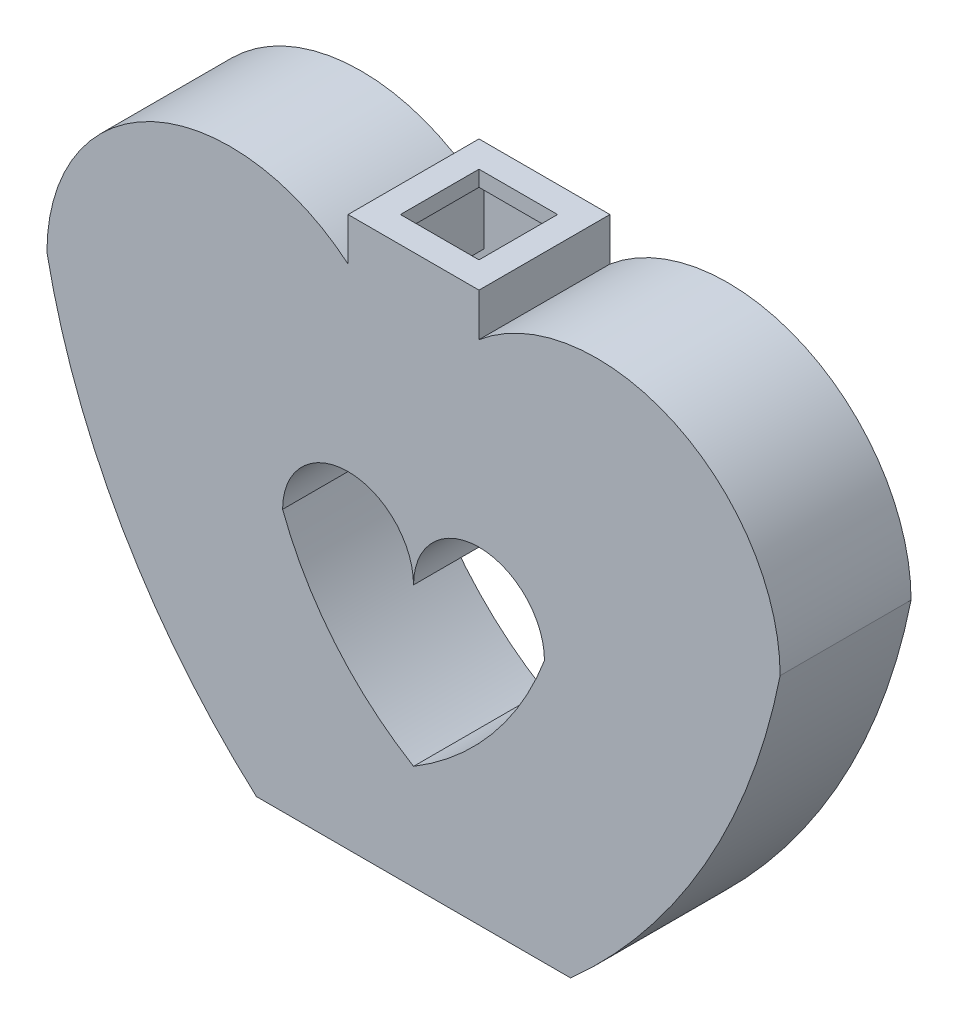
ISO-10303-21;
HEADER;
FILE_DESCRIPTION(('STEP AP214'),'2;1');
FILE_NAME('part.step','',(''),(''),'','','');
FILE_SCHEMA(('AUTOMOTIVE_DESIGN { 1 0 10303 214 1 1 1 1 }'));
ENDSEC;
DATA;
#1=APPLICATION_CONTEXT('core data for automotive mechanical design processes');
#2=APPLICATION_PROTOCOL_DEFINITION('international standard','automotive_design',2000,#1);
#3=PRODUCT_CONTEXT('',#1,'mechanical');
#4=PRODUCT('Part','Part','',(#3));
#5=PRODUCT_RELATED_PRODUCT_CATEGORY('part','',(#4));
#6=PRODUCT_DEFINITION_FORMATION('','',#4);
#7=PRODUCT_DEFINITION_CONTEXT('part definition',#1,'design');
#8=PRODUCT_DEFINITION('design','',#6,#7);
#9=PRODUCT_DEFINITION_SHAPE('','',#8);
#10=(LENGTH_UNIT() NAMED_UNIT(*) SI_UNIT(.MILLI.,.METRE.));
#11=(NAMED_UNIT(*) PLANE_ANGLE_UNIT() SI_UNIT($,.RADIAN.));
#12=(NAMED_UNIT(*) SI_UNIT($,.STERADIAN.) SOLID_ANGLE_UNIT());
#13=UNCERTAINTY_MEASURE_WITH_UNIT(LENGTH_MEASURE(1.E-05),#10,'distance_accuracy_value','');
#14=(GEOMETRIC_REPRESENTATION_CONTEXT(3) GLOBAL_UNCERTAINTY_ASSIGNED_CONTEXT((#13)) GLOBAL_UNIT_ASSIGNED_CONTEXT((#10,
#11,#12)) REPRESENTATION_CONTEXT('',''));
#15=CARTESIAN_POINT('',(0.,0.,0.));
#16=DIRECTION('',(0.,0.,1.));
#17=DIRECTION('',(1.,0.,0.));
#18=AXIS2_PLACEMENT_3D('',#15,#16,#17);
#19=CARTESIAN_POINT('',(0.,3.,25.));
#20=DIRECTION('',(0.,1.,0.));
#21=DIRECTION('',(0.,0.,1.));
#22=AXIS2_PLACEMENT_3D('',#19,#20,#21);
#23=PLANE('',#22);
#24=DIRECTION('',(1.,0.,0.));
#25=VECTOR('',#24,1.);
#26=CARTESIAN_POINT('',(0.,3.,2.));
#27=LINE('',#26,#25);
#28=CARTESIAN_POINT('',(-28.8483161297438,3.,2.));
#29=VERTEX_POINT('',#28);
#30=CARTESIAN_POINT('',(25.8446379227117,3.,2.));
#31=VERTEX_POINT('',#30);
#32=EDGE_CURVE('E375',#29,#31,#27,.T.);
#33=ORIENTED_EDGE('',*,*,#32,.F.);
#34=DIRECTION('',(0.,0.,-1.));
#35=VECTOR('',#34,1.);
#36=CARTESIAN_POINT('',(-28.8483161297438,3.,20.));
#37=LINE('',#36,#35);
#38=CARTESIAN_POINT('',(-28.8483161297438,3.,20.));
#39=VERTEX_POINT('',#38);
#40=EDGE_CURVE('E371',#39,#29,#37,.T.);
#41=ORIENTED_EDGE('',*,*,#40,.F.);
#42=DIRECTION('',(1.,0.,0.));
#43=VECTOR('',#42,1.);
#44=CARTESIAN_POINT('',(0.,3.,20.));
#45=LINE('',#44,#43);
#46=CARTESIAN_POINT('',(25.8446379227117,3.,20.));
#47=VERTEX_POINT('',#46);
#48=EDGE_CURVE('E330',#39,#47,#45,.T.);
#49=ORIENTED_EDGE('',*,*,#48,.T.);
#50=DIRECTION('',(0.,0.,-1.));
#51=VECTOR('',#50,1.);
#52=CARTESIAN_POINT('',(25.8446379227117,3.,20.));
#53=LINE('',#52,#51);
#54=EDGE_CURVE('E364',#47,#31,#53,.T.);
#55=ORIENTED_EDGE('',*,*,#54,.T.);
#56=EDGE_LOOP('',(#33,#41,#49,#55));
#57=FACE_BOUND('',#56,.T.);
#58=ADVANCED_FACE('F47',(#57),#23,.T.);
#59=CARTESIAN_POINT('',(-54.5221019866548,94.7269154209456,25.));
#60=DIRECTION('',(0.,0.,-1.));
#61=DIRECTION('',(-1.,0.,0.));
#62=AXIS2_PLACEMENT_3D('',#59,#60,#61);
#63=CYLINDRICAL_SURFACE('',#62,121.953433310838);
#64=CARTESIAN_POINT('',(-54.5221019866548,94.7269154209456,2.));
#65=DIRECTION('',(0.,0.,1.));
#66=DIRECTION('',(1.,0.,0.));
#67=AXIS2_PLACEMENT_3D('',#64,#65,#66);
#68=CIRCLE('',#67,121.953433310838);
#69=CARTESIAN_POINT('',(66.170757203177,77.2376719586197,2.));
#70=VERTEX_POINT('',#69);
#71=EDGE_CURVE('E368',#31,#70,#68,.T.);
#72=ORIENTED_EDGE('',*,*,#71,.F.);
#73=ORIENTED_EDGE('',*,*,#54,.F.);
#74=CARTESIAN_POINT('',(-54.5221019866548,94.7269154209456,20.));
#75=DIRECTION('',(0.,0.,1.));
#76=DIRECTION('',(1.,0.,0.));
#77=AXIS2_PLACEMENT_3D('',#74,#75,#76);
#78=CIRCLE('',#77,121.953433310838);
#79=CARTESIAN_POINT('',(66.170757203177,77.2376719586197,20.));
#80=VERTEX_POINT('',#79);
#81=EDGE_CURVE('E327',#47,#80,#78,.T.);
#82=ORIENTED_EDGE('',*,*,#81,.T.);
#83=DIRECTION('',(0.,0.,-1.));
#84=VECTOR('',#83,1.);
#85=CARTESIAN_POINT('',(66.170757203177,77.2376719586197,20.));
#86=LINE('',#85,#84);
#87=EDGE_CURVE('E357',#80,#70,#86,.T.);
#88=ORIENTED_EDGE('',*,*,#87,.T.);
#89=EDGE_LOOP('',(#72,#73,#82,#88));
#90=FACE_BOUND('',#89,.T.);
#91=ADVANCED_FACE('F598',(#90),#63,.F.);
#92=CARTESIAN_POINT('',(35.,70.,25.));
#93=DIRECTION('',(0.,0.,-1.));
#94=DIRECTION('',(-1.,0.,0.));
#95=AXIS2_PLACEMENT_3D('',#92,#93,#94);
#96=CYLINDRICAL_SURFACE('',#95,32.);
#97=CARTESIAN_POINT('',(35.,70.,2.));
#98=DIRECTION('',(0.,0.,1.));
#99=DIRECTION('',(1.,0.,0.));
#100=AXIS2_PLACEMENT_3D('',#97,#98,#99);
#101=CIRCLE('',#100,32.);
#102=CARTESIAN_POINT('',(9.50000000000001,89.3326149291816,2.));
#103=VERTEX_POINT('',#102);
#104=EDGE_CURVE('E361',#70,#103,#101,.T.);
#105=ORIENTED_EDGE('',*,*,#104,.F.);
#106=ORIENTED_EDGE('',*,*,#87,.F.);
#107=CARTESIAN_POINT('',(35.,70.,20.));
#108=DIRECTION('',(0.,0.,1.));
#109=DIRECTION('',(1.,0.,0.));
#110=AXIS2_PLACEMENT_3D('',#107,#108,#109);
#111=CIRCLE('',#110,32.);
#112=CARTESIAN_POINT('',(9.50000000000001,89.3326149291816,20.));
#113=VERTEX_POINT('',#112);
#114=EDGE_CURVE('E324',#80,#113,#111,.T.);
#115=ORIENTED_EDGE('',*,*,#114,.T.);
#116=DIRECTION('',(0.,0.,-1.));
#117=VECTOR('',#116,1.);
#118=CARTESIAN_POINT('',(9.50000000000001,89.3326149291816,20.));
#119=LINE('',#118,#117);
#120=EDGE_CURVE('E262',#113,#103,#119,.T.);
#121=ORIENTED_EDGE('',*,*,#120,.T.);
#122=EDGE_LOOP('',(#105,#106,#115,#121));
#123=FACE_BOUND('',#122,.T.);
#124=ADVANCED_FACE('F605',(#123),#96,.F.);
#125=CARTESIAN_POINT('',(-35.,70.,25.));
#126=DIRECTION('',(0.,0.,-1.));
#127=DIRECTION('',(-1.,0.,0.));
#128=AXIS2_PLACEMENT_3D('',#125,#126,#127);
#129=CYLINDRICAL_SURFACE('',#128,32.);
#130=CARTESIAN_POINT('',(-35.,70.,2.));
#131=DIRECTION('',(0.,0.,1.));
#132=DIRECTION('',(1.,0.,0.));
#133=AXIS2_PLACEMENT_3D('',#130,#131,#132);
#134=CIRCLE('',#133,32.);
#135=CARTESIAN_POINT('',(-9.5,89.3326149291816,2.));
#136=VERTEX_POINT('',#135);
#137=CARTESIAN_POINT('',(-66.9986839408012,70.2902172577764,2.));
#138=VERTEX_POINT('',#137);
#139=EDGE_CURVE('E354',#136,#138,#134,.T.);
#140=ORIENTED_EDGE('',*,*,#139,.F.);
#141=DIRECTION('',(0.,0.,-1.));
#142=VECTOR('',#141,1.);
#143=CARTESIAN_POINT('',(-9.5,89.3326149291816,20.));
#144=LINE('',#143,#142);
#145=CARTESIAN_POINT('',(-9.5,89.3326149291816,20.));
#146=VERTEX_POINT('',#145);
#147=EDGE_CURVE('E351',#146,#136,#144,.T.);
#148=ORIENTED_EDGE('',*,*,#147,.F.);
#149=CARTESIAN_POINT('',(-35.,70.,20.));
#150=DIRECTION('',(0.,0.,1.));
#151=DIRECTION('',(1.,0.,0.));
#152=AXIS2_PLACEMENT_3D('',#149,#150,#151);
#153=CIRCLE('',#152,32.);
#154=CARTESIAN_POINT('',(-66.9986839408012,70.2902172577764,20.));
#155=VERTEX_POINT('',#154);
#156=EDGE_CURVE('E336',#146,#155,#153,.T.);
#157=ORIENTED_EDGE('',*,*,#156,.T.);
#158=DIRECTION('',(0.,0.,-1.));
#159=VECTOR('',#158,1.);
#160=CARTESIAN_POINT('',(-66.9986839408012,70.2902172577764,20.));
#161=LINE('',#160,#159);
#162=EDGE_CURVE('E343',#155,#138,#161,.T.);
#163=ORIENTED_EDGE('',*,*,#162,.T.);
#164=EDGE_LOOP('',(#140,#148,#157,#163));
#165=FACE_BOUND('',#164,.T.);
#166=ADVANCED_FACE('F612',(#165),#129,.F.);
#167=CARTESIAN_POINT('',(54.5221019866548,94.7269154209456,25.));
#168=DIRECTION('',(0.,0.,-1.));
#169=DIRECTION('',(-1.,0.,0.));
#170=AXIS2_PLACEMENT_3D('',#167,#168,#169);
#171=CYLINDRICAL_SURFACE('',#170,123.953433310838);
#172=CARTESIAN_POINT('',(54.5221019866548,94.7269154209456,2.));
#173=DIRECTION('',(0.,0.,1.));
#174=DIRECTION('',(1.,0.,0.));
#175=AXIS2_PLACEMENT_3D('',#172,#173,#174);
#176=CIRCLE('',#175,123.953433310838);
#177=EDGE_CURVE('E347',#138,#29,#176,.T.);
#178=ORIENTED_EDGE('',*,*,#177,.F.);
#179=ORIENTED_EDGE('',*,*,#162,.F.);
#180=CARTESIAN_POINT('',(54.5221019866548,94.7269154209456,20.));
#181=DIRECTION('',(0.,0.,1.));
#182=DIRECTION('',(1.,0.,0.));
#183=AXIS2_PLACEMENT_3D('',#180,#181,#182);
#184=CIRCLE('',#183,123.953433310838);
#185=EDGE_CURVE('E333',#155,#39,#184,.T.);
#186=ORIENTED_EDGE('',*,*,#185,.T.);
#187=ORIENTED_EDGE('',*,*,#40,.T.);
#188=EDGE_LOOP('',(#178,#179,#186,#187));
#189=FACE_BOUND('',#188,.T.);
#190=ADVANCED_FACE('F616',(#189),#171,.F.);
#191=CARTESIAN_POINT('',(54.5221019866548,94.7269154209456,20.));
#192=DIRECTION('',(0.,0.,1.));
#193=DIRECTION('',(1.,0.,0.));
#194=AXIS2_PLACEMENT_3D('',#191,#192,#193);
#195=PLANE('',#194);
#196=DIRECTION('',(0.,1.,0.));
#197=VECTOR('',#196,1.);
#198=CARTESIAN_POINT('',(7.5,83.,20.));
#199=LINE('',#198,#197);
#200=CARTESIAN_POINT('',(7.5,102.,20.));
#201=VERTEX_POINT('',#200);
#202=CARTESIAN_POINT('',(7.5,105.,20.));
#203=VERTEX_POINT('',#202);
#204=EDGE_CURVE('E535',#201,#203,#199,.T.);
#205=ORIENTED_EDGE('',*,*,#204,.F.);
#206=DIRECTION('',(1.,0.,0.));
#207=VECTOR('',#206,1.);
#208=CARTESIAN_POINT('',(54.5221019866548,102.,20.));
#209=LINE('',#208,#207);
#210=CARTESIAN_POINT('',(9.50000000000001,102.,20.));
#211=VERTEX_POINT('',#210);
#212=EDGE_CURVE('E248',#201,#211,#209,.T.);
#213=ORIENTED_EDGE('',*,*,#212,.T.);
#214=DIRECTION('',(0.,-1.,0.));
#215=VECTOR('',#214,1.);
#216=CARTESIAN_POINT('',(9.50000000000001,94.7269154209456,20.));
#217=LINE('',#216,#215);
#218=EDGE_CURVE('E270',#211,#113,#217,.T.);
#219=ORIENTED_EDGE('',*,*,#218,.T.);
#220=ORIENTED_EDGE('',*,*,#114,.F.);
#221=ORIENTED_EDGE('',*,*,#81,.F.);
#222=ORIENTED_EDGE('',*,*,#48,.F.);
#223=ORIENTED_EDGE('',*,*,#185,.F.);
#224=ORIENTED_EDGE('',*,*,#156,.F.);
#225=DIRECTION('',(0.,-1.,0.));
#226=VECTOR('',#225,1.);
#227=CARTESIAN_POINT('',(-9.5,105.,20.));
#228=LINE('',#227,#226);
#229=CARTESIAN_POINT('',(-9.5,102.,20.));
#230=VERTEX_POINT('',#229);
#231=EDGE_CURVE('E339',#230,#146,#228,.T.);
#232=ORIENTED_EDGE('',*,*,#231,.F.);
#233=CARTESIAN_POINT('',(-7.5,102.,20.));
#234=VERTEX_POINT('',#233);
#235=EDGE_CURVE('E255',#230,#234,#209,.T.);
#236=ORIENTED_EDGE('',*,*,#235,.T.);
#237=DIRECTION('',(0.,1.,0.));
#238=VECTOR('',#237,1.);
#239=CARTESIAN_POINT('',(-7.5,83.,20.));
#240=LINE('',#239,#238);
#241=CARTESIAN_POINT('',(-7.5,105.,20.));
#242=VERTEX_POINT('',#241);
#243=EDGE_CURVE('E383',#234,#242,#240,.T.);
#244=ORIENTED_EDGE('',*,*,#243,.T.);
#245=DIRECTION('',(-1.,0.,0.));
#246=VECTOR('',#245,1.);
#247=CARTESIAN_POINT('',(0.,105.,20.));
#248=LINE('',#247,#246);
#249=EDGE_CURVE('E527',#203,#242,#248,.T.);
#250=ORIENTED_EDGE('',*,*,#249,.F.);
#251=EDGE_LOOP('',(#205,#213,#219,#220,#221,#222,#223,#224,#232,#236,#244,#250));
#252=FACE_BOUND('',#251,.T.);
#253=CARTESIAN_POINT('',(12.5,50.,20.));
#254=DIRECTION('',(0.,0.,1.));
#255=DIRECTION('',(1.,0.,0.));
#256=AXIS2_PLACEMENT_3D('',#253,#254,#255);
#257=CIRCLE('',#256,15.5);
#258=CARTESIAN_POINT('',(27.9895817233488,49.4317940200073,20.));
#259=VERTEX_POINT('',#258);
#260=CARTESIAN_POINT('',(0.,59.1651513899117,20.));
#261=VERTEX_POINT('',#260);
#262=EDGE_CURVE('E294',#259,#261,#257,.T.);
#263=ORIENTED_EDGE('',*,*,#262,.T.);
#264=CARTESIAN_POINT('',(-12.5,50.,20.));
#265=DIRECTION('',(0.,0.,1.));
#266=DIRECTION('',(1.,0.,0.));
#267=AXIS2_PLACEMENT_3D('',#264,#265,#266);
#268=CIRCLE('',#267,15.5);
#269=CARTESIAN_POINT('',(-27.9895817233488,49.4317940200074,20.));
#270=VERTEX_POINT('',#269);
#271=EDGE_CURVE('E287',#261,#270,#268,.T.);
#272=ORIENTED_EDGE('',*,*,#271,.T.);
#273=CARTESIAN_POINT('',(30.702628548264,71.0021904568865,20.));
#274=DIRECTION('',(0.,0.,1.));
#275=DIRECTION('',(1.,0.,0.));
#276=AXIS2_PLACEMENT_3D('',#273,#274,#275);
#277=CIRCLE('',#276,62.5304529730222);
#278=CARTESIAN_POINT('',(0.,16.5282870788591,20.));
#279=VERTEX_POINT('',#278);
#280=EDGE_CURVE('E281',#270,#279,#277,.T.);
#281=ORIENTED_EDGE('',*,*,#280,.T.);
#282=CARTESIAN_POINT('',(-30.7026285482639,71.0021904568865,20.));
#283=DIRECTION('',(0.,0.,1.));
#284=DIRECTION('',(1.,0.,0.));
#285=AXIS2_PLACEMENT_3D('',#282,#283,#284);
#286=CIRCLE('',#285,62.5304529730221);
#287=EDGE_CURVE('E301',#279,#259,#286,.T.);
#288=ORIENTED_EDGE('',*,*,#287,.T.);
#289=EDGE_LOOP('',(#263,#272,#281,#288));
#290=FACE_BOUND('',#289,.T.);
#291=ADVANCED_FACE('F386',(#252,#290),#195,.F.);
#292=CARTESIAN_POINT('',(54.5221019866548,94.7269154209456,2.));
#293=DIRECTION('',(0.,0.,1.));
#294=DIRECTION('',(1.,0.,0.));
#295=AXIS2_PLACEMENT_3D('',#292,#293,#294);
#296=PLANE('',#295);
#297=ORIENTED_EDGE('',*,*,#139,.T.);
#298=ORIENTED_EDGE('',*,*,#177,.T.);
#299=ORIENTED_EDGE('',*,*,#32,.T.);
#300=ORIENTED_EDGE('',*,*,#71,.T.);
#301=ORIENTED_EDGE('',*,*,#104,.T.);
#302=DIRECTION('',(0.,-1.,0.));
#303=VECTOR('',#302,1.);
#304=CARTESIAN_POINT('',(9.50000000000001,94.7269154209456,2.));
#305=LINE('',#304,#303);
#306=CARTESIAN_POINT('',(9.50000000000001,102.,2.));
#307=VERTEX_POINT('',#306);
#308=EDGE_CURVE('E320',#307,#103,#305,.T.);
#309=ORIENTED_EDGE('',*,*,#308,.F.);
#310=DIRECTION('',(-1.,0.,0.));
#311=VECTOR('',#310,1.);
#312=CARTESIAN_POINT('',(0.,102.,2.));
#313=LINE('',#312,#311);
#314=CARTESIAN_POINT('',(-9.5,102.,2.));
#315=VERTEX_POINT('',#314);
#316=EDGE_CURVE('E235',#307,#315,#313,.T.);
#317=ORIENTED_EDGE('',*,*,#316,.T.);
#318=DIRECTION('',(0.,-1.,0.));
#319=VECTOR('',#318,1.);
#320=CARTESIAN_POINT('',(-9.5,105.,2.));
#321=LINE('',#320,#319);
#322=EDGE_CURVE('E273',#315,#136,#321,.T.);
#323=ORIENTED_EDGE('',*,*,#322,.T.);
#324=EDGE_LOOP('',(#297,#298,#299,#300,#301,#309,#317,#323));
#325=FACE_BOUND('',#324,.T.);
#326=CARTESIAN_POINT('',(-30.7026285482639,71.0021904568865,2.));
#327=DIRECTION('',(0.,0.,1.));
#328=DIRECTION('',(1.,0.,0.));
#329=AXIS2_PLACEMENT_3D('',#326,#327,#328);
#330=CIRCLE('',#329,62.5304529730221);
#331=CARTESIAN_POINT('',(0.,16.5282870788591,2.));
#332=VERTEX_POINT('',#331);
#333=CARTESIAN_POINT('',(27.9895817233488,49.4317940200073,2.));
#334=VERTEX_POINT('',#333);
#335=EDGE_CURVE('E316',#332,#334,#330,.T.);
#336=ORIENTED_EDGE('',*,*,#335,.F.);
#337=CARTESIAN_POINT('',(30.702628548264,71.0021904568865,2.));
#338=DIRECTION('',(0.,0.,1.));
#339=DIRECTION('',(1.,0.,0.));
#340=AXIS2_PLACEMENT_3D('',#337,#338,#339);
#341=CIRCLE('',#340,62.5304529730222);
#342=CARTESIAN_POINT('',(-27.9895817233488,49.4317940200074,2.));
#343=VERTEX_POINT('',#342);
#344=EDGE_CURVE('E304',#343,#332,#341,.T.);
#345=ORIENTED_EDGE('',*,*,#344,.F.);
#346=CARTESIAN_POINT('',(-12.5,50.,2.));
#347=DIRECTION('',(0.,0.,1.));
#348=DIRECTION('',(1.,0.,0.));
#349=AXIS2_PLACEMENT_3D('',#346,#347,#348);
#350=CIRCLE('',#349,15.5);
#351=CARTESIAN_POINT('',(0.,59.1651513899117,2.));
#352=VERTEX_POINT('',#351);
#353=EDGE_CURVE('E308',#352,#343,#350,.T.);
#354=ORIENTED_EDGE('',*,*,#353,.F.);
#355=CARTESIAN_POINT('',(12.5,50.,2.));
#356=DIRECTION('',(0.,0.,1.));
#357=DIRECTION('',(1.,0.,0.));
#358=AXIS2_PLACEMENT_3D('',#355,#356,#357);
#359=CIRCLE('',#358,15.5);
#360=EDGE_CURVE('E312',#334,#352,#359,.T.);
#361=ORIENTED_EDGE('',*,*,#360,.F.);
#362=EDGE_LOOP('',(#336,#345,#354,#361));
#363=FACE_BOUND('',#362,.T.);
#364=ADVANCED_FACE('F623',(#325,#363),#296,.T.);
#365=CARTESIAN_POINT('',(-30.7026285482639,71.0021904568865,25.));
#366=DIRECTION('',(0.,0.,-1.));
#367=DIRECTION('',(-1.,0.,0.));
#368=AXIS2_PLACEMENT_3D('',#365,#366,#367);
#369=CYLINDRICAL_SURFACE('',#368,62.5304529730221);
#370=ORIENTED_EDGE('',*,*,#335,.T.);
#371=DIRECTION('',(0.,0.,-1.));
#372=VECTOR('',#371,1.);
#373=CARTESIAN_POINT('',(27.9895817233488,49.4317940200073,20.));
#374=LINE('',#373,#372);
#375=EDGE_CURVE('E297',#259,#334,#374,.T.);
#376=ORIENTED_EDGE('',*,*,#375,.F.);
#377=ORIENTED_EDGE('',*,*,#287,.F.);
#378=DIRECTION('',(0.,0.,-1.));
#379=VECTOR('',#378,1.);
#380=CARTESIAN_POINT('',(0.,16.5282870788591,20.));
#381=LINE('',#380,#379);
#382=EDGE_CURVE('E277',#279,#332,#381,.T.);
#383=ORIENTED_EDGE('',*,*,#382,.T.);
#384=EDGE_LOOP('',(#370,#376,#377,#383));
#385=FACE_BOUND('',#384,.T.);
#386=ADVANCED_FACE('F626',(#385),#369,.T.);
#387=CARTESIAN_POINT('',(12.5,50.,25.));
#388=DIRECTION('',(0.,0.,-1.));
#389=DIRECTION('',(-1.,0.,0.));
#390=AXIS2_PLACEMENT_3D('',#387,#388,#389);
#391=CYLINDRICAL_SURFACE('',#390,15.5);
#392=ORIENTED_EDGE('',*,*,#360,.T.);
#393=DIRECTION('',(0.,0.,-1.));
#394=VECTOR('',#393,1.);
#395=CARTESIAN_POINT('',(0.,59.1651513899117,12.5));
#396=LINE('',#395,#394);
#397=EDGE_CURVE('E291',#261,#352,#396,.T.);
#398=ORIENTED_EDGE('',*,*,#397,.F.);
#399=ORIENTED_EDGE('',*,*,#262,.F.);
#400=ORIENTED_EDGE('',*,*,#375,.T.);
#401=EDGE_LOOP('',(#392,#398,#399,#400));
#402=FACE_BOUND('',#401,.T.);
#403=ADVANCED_FACE('F629',(#402),#391,.T.);
#404=CARTESIAN_POINT('',(-12.5,50.,25.));
#405=DIRECTION('',(0.,0.,-1.));
#406=DIRECTION('',(-1.,0.,0.));
#407=AXIS2_PLACEMENT_3D('',#404,#405,#406);
#408=CYLINDRICAL_SURFACE('',#407,15.5);
#409=ORIENTED_EDGE('',*,*,#353,.T.);
#410=DIRECTION('',(0.,0.,-1.));
#411=VECTOR('',#410,1.);
#412=CARTESIAN_POINT('',(-27.9895817233488,49.4317940200074,20.));
#413=LINE('',#412,#411);
#414=EDGE_CURVE('E284',#270,#343,#413,.T.);
#415=ORIENTED_EDGE('',*,*,#414,.F.);
#416=ORIENTED_EDGE('',*,*,#271,.F.);
#417=ORIENTED_EDGE('',*,*,#397,.T.);
#418=EDGE_LOOP('',(#409,#415,#416,#417));
#419=FACE_BOUND('',#418,.T.);
#420=ADVANCED_FACE('F633',(#419),#408,.T.);
#421=CARTESIAN_POINT('',(30.702628548264,71.0021904568865,25.));
#422=DIRECTION('',(0.,0.,-1.));
#423=DIRECTION('',(-1.,0.,0.));
#424=AXIS2_PLACEMENT_3D('',#421,#422,#423);
#425=CYLINDRICAL_SURFACE('',#424,62.5304529730222);
#426=ORIENTED_EDGE('',*,*,#344,.T.);
#427=ORIENTED_EDGE('',*,*,#382,.F.);
#428=ORIENTED_EDGE('',*,*,#280,.F.);
#429=ORIENTED_EDGE('',*,*,#414,.T.);
#430=EDGE_LOOP('',(#426,#427,#428,#429));
#431=FACE_BOUND('',#430,.T.);
#432=ADVANCED_FACE('F637',(#431),#425,.T.);
#433=CARTESIAN_POINT('',(-9.5,105.,25.));
#434=DIRECTION('',(1.,0.,0.));
#435=DIRECTION('',(0.,0.,-1.));
#436=AXIS2_PLACEMENT_3D('',#433,#434,#435);
#437=PLANE('',#436);
#438=ORIENTED_EDGE('',*,*,#322,.F.);
#439=DIRECTION('',(0.,0.,1.));
#440=VECTOR('',#439,1.);
#441=CARTESIAN_POINT('',(-9.5,102.,0.));
#442=LINE('',#441,#440);
#443=EDGE_CURVE('E256',#315,#230,#442,.T.);
#444=ORIENTED_EDGE('',*,*,#443,.T.);
#445=ORIENTED_EDGE('',*,*,#231,.T.);
#446=ORIENTED_EDGE('',*,*,#147,.T.);
#447=EDGE_LOOP('',(#438,#444,#445,#446));
#448=FACE_BOUND('',#447,.T.);
#449=ADVANCED_FACE('F393',(#448),#437,.T.);
#450=CARTESIAN_POINT('',(9.50000000000001,105.,0.));
#451=DIRECTION('',(-1.,0.,0.));
#452=DIRECTION('',(0.,0.,1.));
#453=AXIS2_PLACEMENT_3D('',#450,#451,#452);
#454=PLANE('',#453);
#455=ORIENTED_EDGE('',*,*,#218,.F.);
#456=DIRECTION('',(0.,0.,-1.));
#457=VECTOR('',#456,1.);
#458=CARTESIAN_POINT('',(9.50000000000001,102.,0.));
#459=LINE('',#458,#457);
#460=EDGE_CURVE('E250',#211,#307,#459,.T.);
#461=ORIENTED_EDGE('',*,*,#460,.T.);
#462=ORIENTED_EDGE('',*,*,#308,.T.);
#463=ORIENTED_EDGE('',*,*,#120,.F.);
#464=EDGE_LOOP('',(#455,#461,#462,#463));
#465=FACE_BOUND('',#464,.T.);
#466=ADVANCED_FACE('F643',(#465),#454,.T.);
#467=CARTESIAN_POINT('',(0.,102.,0.));
#468=DIRECTION('',(0.,-1.,0.));
#469=DIRECTION('',(0.,0.,-1.));
#470=AXIS2_PLACEMENT_3D('',#467,#468,#469);
#471=PLANE('',#470);
#472=DIRECTION('',(0.,0.,1.));
#473=VECTOR('',#472,1.);
#474=CARTESIAN_POINT('',(7.5,102.,0.));
#475=LINE('',#474,#473);
#476=CARTESIAN_POINT('',(7.5,102.,5.));
#477=VERTEX_POINT('',#476);
#478=EDGE_CURVE('E11',#477,#201,#475,.T.);
#479=ORIENTED_EDGE('',*,*,#478,.F.);
#480=DIRECTION('',(1.,0.,0.));
#481=VECTOR('',#480,1.);
#482=CARTESIAN_POINT('',(0.,102.,5.));
#483=LINE('',#482,#481);
#484=CARTESIAN_POINT('',(-7.5,102.,5.));
#485=VERTEX_POINT('',#484);
#486=EDGE_CURVE('E229',#485,#477,#483,.T.);
#487=ORIENTED_EDGE('',*,*,#486,.F.);
#488=DIRECTION('',(0.,0.,-1.));
#489=VECTOR('',#488,1.);
#490=CARTESIAN_POINT('',(-7.5,102.,0.));
#491=LINE('',#490,#489);
#492=EDGE_CURVE('E56',#234,#485,#491,.T.);
#493=ORIENTED_EDGE('',*,*,#492,.F.);
#494=ORIENTED_EDGE('',*,*,#235,.F.);
#495=ORIENTED_EDGE('',*,*,#443,.F.);
#496=ORIENTED_EDGE('',*,*,#316,.F.);
#497=ORIENTED_EDGE('',*,*,#460,.F.);
#498=ORIENTED_EDGE('',*,*,#212,.F.);
#499=EDGE_LOOP('',(#479,#487,#493,#494,#495,#496,#497,#498));
#500=FACE_BOUND('',#499,.T.);
#501=ADVANCED_FACE('F49',(#500),#471,.T.);
#502=CARTESIAN_POINT('',(7.5,83.,20.));
#503=DIRECTION('',(1.,0.,0.));
#504=DIRECTION('',(0.,0.,-1.));
#505=AXIS2_PLACEMENT_3D('',#502,#503,#504);
#506=PLANE('',#505);
#507=DIRECTION('',(0.,1.,0.));
#508=VECTOR('',#507,1.);
#509=CARTESIAN_POINT('',(7.5,83.,5.));
#510=LINE('',#509,#508);
#511=CARTESIAN_POINT('',(7.5,105.,5.));
#512=VERTEX_POINT('',#511);
#513=EDGE_CURVE('E63',#477,#512,#510,.T.);
#514=ORIENTED_EDGE('',*,*,#513,.F.);
#515=ORIENTED_EDGE('',*,*,#478,.T.);
#516=ORIENTED_EDGE('',*,*,#204,.T.);
#517=DIRECTION('',(0.,0.,1.));
#518=VECTOR('',#517,1.);
#519=CARTESIAN_POINT('',(7.5,105.,0.));
#520=LINE('',#519,#518);
#521=EDGE_CURVE('E242',#512,#203,#520,.T.);
#522=ORIENTED_EDGE('',*,*,#521,.F.);
#523=EDGE_LOOP('',(#514,#515,#516,#522));
#524=FACE_BOUND('',#523,.T.);
#525=ADVANCED_FACE('F238',(#524),#506,.F.);
#526=CARTESIAN_POINT('',(-7.5,83.,20.));
#527=DIRECTION('',(-1.,0.,0.));
#528=DIRECTION('',(0.,0.,1.));
#529=AXIS2_PLACEMENT_3D('',#526,#527,#528);
#530=PLANE('',#529);
#531=ORIENTED_EDGE('',*,*,#243,.F.);
#532=ORIENTED_EDGE('',*,*,#492,.T.);
#533=DIRECTION('',(0.,1.,0.));
#534=VECTOR('',#533,1.);
#535=CARTESIAN_POINT('',(-7.5,83.,5.));
#536=LINE('',#535,#534);
#537=CARTESIAN_POINT('',(-7.5,105.,5.));
#538=VERTEX_POINT('',#537);
#539=EDGE_CURVE('E68',#485,#538,#536,.T.);
#540=ORIENTED_EDGE('',*,*,#539,.T.);
#541=DIRECTION('',(0.,0.,-1.));
#542=VECTOR('',#541,1.);
#543=CARTESIAN_POINT('',(-7.5,105.,0.));
#544=LINE('',#543,#542);
#545=EDGE_CURVE('E530',#242,#538,#544,.T.);
#546=ORIENTED_EDGE('',*,*,#545,.F.);
#547=EDGE_LOOP('',(#531,#532,#540,#546));
#548=FACE_BOUND('',#547,.T.);
#549=ADVANCED_FACE('F380',(#548),#530,.F.);
#550=CARTESIAN_POINT('',(-7.5,83.,5.));
#551=DIRECTION('',(0.,0.,-1.));
#552=DIRECTION('',(-1.,0.,0.));
#553=AXIS2_PLACEMENT_3D('',#550,#551,#552);
#554=PLANE('',#553);
#555=ORIENTED_EDGE('',*,*,#539,.F.);
#556=ORIENTED_EDGE('',*,*,#486,.T.);
#557=ORIENTED_EDGE('',*,*,#513,.T.);
#558=DIRECTION('',(1.,0.,0.));
#559=VECTOR('',#558,1.);
#560=CARTESIAN_POINT('',(0.,105.,5.));
#561=LINE('',#560,#559);
#562=EDGE_CURVE('E533',#538,#512,#561,.T.);
#563=ORIENTED_EDGE('',*,*,#562,.F.);
#564=EDGE_LOOP('',(#555,#556,#557,#563));
#565=FACE_BOUND('',#564,.T.);
#566=ADVANCED_FACE('F230',(#565),#554,.F.);
#567=CARTESIAN_POINT('',(0.,0.,25.));
#568=DIRECTION('',(0.,1.,0.));
#569=DIRECTION('',(0.,0.,1.));
#570=AXIS2_PLACEMENT_3D('',#567,#568,#569);
#571=PLANE('',#570);
#572=DIRECTION('',(1.,0.,0.));
#573=VECTOR('',#572,1.);
#574=CARTESIAN_POINT('',(0.,0.,0.));
#575=LINE('',#574,#573);
#576=CARTESIAN_POINT('',(-30.,0.,0.));
#577=VERTEX_POINT('',#576);
#578=CARTESIAN_POINT('',(30.,0.,0.));
#579=VERTEX_POINT('',#578);
#580=EDGE_CURVE('E437',#577,#579,#575,.T.);
#581=ORIENTED_EDGE('',*,*,#580,.T.);
#582=DIRECTION('',(0.,0.,-1.));
#583=VECTOR('',#582,1.);
#584=CARTESIAN_POINT('',(30.,0.,25.));
#585=LINE('',#584,#583);
#586=CARTESIAN_POINT('',(30.,0.,25.));
#587=VERTEX_POINT('',#586);
#588=EDGE_CURVE('E377',#587,#579,#585,.T.);
#589=ORIENTED_EDGE('',*,*,#588,.F.);
#590=DIRECTION('',(1.,0.,0.));
#591=VECTOR('',#590,1.);
#592=CARTESIAN_POINT('',(0.,0.,25.));
#593=LINE('',#592,#591);
#594=CARTESIAN_POINT('',(-30.,0.,25.));
#595=VERTEX_POINT('',#594);
#596=EDGE_CURVE('E427',#595,#587,#593,.T.);
#597=ORIENTED_EDGE('',*,*,#596,.F.);
#598=DIRECTION('',(0.,0.,-1.));
#599=VECTOR('',#598,1.);
#600=CARTESIAN_POINT('',(-30.,0.,25.));
#601=LINE('',#600,#599);
#602=EDGE_CURVE('E418',#595,#577,#601,.T.);
#603=ORIENTED_EDGE('',*,*,#602,.T.);
#604=EDGE_LOOP('',(#581,#589,#597,#603));
#605=FACE_BOUND('',#604,.T.);
#606=ADVANCED_FACE('F582',(#605),#571,.F.);
#607=CARTESIAN_POINT('',(-54.5221019866548,94.7269154209456,25.));
#608=DIRECTION('',(0.,0.,-1.));
#609=DIRECTION('',(-1.,0.,0.));
#610=AXIS2_PLACEMENT_3D('',#607,#608,#609);
#611=CYLINDRICAL_SURFACE('',#610,126.953433310838);
#612=CARTESIAN_POINT('',(-54.5221019866548,94.7269154209456,0.));
#613=DIRECTION('',(0.,0.,1.));
#614=DIRECTION('',(1.,0.,0.));
#615=AXIS2_PLACEMENT_3D('',#612,#613,#614);
#616=CIRCLE('',#615,126.953433310838);
#617=CARTESIAN_POINT('',(70.,69.9999999999999,0.));
#618=VERTEX_POINT('',#617);
#619=EDGE_CURVE('E434',#579,#618,#616,.T.);
#620=ORIENTED_EDGE('',*,*,#619,.T.);
#621=DIRECTION('',(0.,0.,-1.));
#622=VECTOR('',#621,1.);
#623=CARTESIAN_POINT('',(70.,69.9999999999999,25.));
#624=LINE('',#623,#622);
#625=CARTESIAN_POINT('',(70.,69.9999999999999,25.));
#626=VERTEX_POINT('',#625);
#627=EDGE_CURVE('E403',#626,#618,#624,.T.);
#628=ORIENTED_EDGE('',*,*,#627,.F.);
#629=CARTESIAN_POINT('',(-54.5221019866548,94.7269154209456,25.));
#630=DIRECTION('',(0.,0.,1.));
#631=DIRECTION('',(1.,0.,0.));
#632=AXIS2_PLACEMENT_3D('',#629,#630,#631);
#633=CIRCLE('',#632,126.953433310838);
#634=EDGE_CURVE('E449',#587,#626,#633,.T.);
#635=ORIENTED_EDGE('',*,*,#634,.F.);
#636=ORIENTED_EDGE('',*,*,#588,.T.);
#637=EDGE_LOOP('',(#620,#628,#635,#636));
#638=FACE_BOUND('',#637,.T.);
#639=ADVANCED_FACE('F585',(#638),#611,.T.);
#640=CARTESIAN_POINT('',(35.,70.,25.));
#641=DIRECTION('',(0.,0.,-1.));
#642=DIRECTION('',(-1.,0.,0.));
#643=AXIS2_PLACEMENT_3D('',#640,#641,#642);
#644=CYLINDRICAL_SURFACE('',#643,35.);
#645=CARTESIAN_POINT('',(35.,70.,0.));
#646=DIRECTION('',(0.,0.,1.));
#647=DIRECTION('',(1.,0.,0.));
#648=AXIS2_PLACEMENT_3D('',#645,#646,#647);
#649=CIRCLE('',#648,35.);
#650=CARTESIAN_POINT('',(12.5,96.809513236909,0.));
#651=VERTEX_POINT('',#650);
#652=EDGE_CURVE('E431',#618,#651,#649,.T.);
#653=ORIENTED_EDGE('',*,*,#652,.T.);
#654=DIRECTION('',(0.,0.,-1.));
#655=VECTOR('',#654,1.);
#656=CARTESIAN_POINT('',(12.5,96.809513236909,25.));
#657=LINE('',#656,#655);
#658=CARTESIAN_POINT('',(12.5,96.809513236909,25.));
#659=VERTEX_POINT('',#658);
#660=EDGE_CURVE('E407',#659,#651,#657,.T.);
#661=ORIENTED_EDGE('',*,*,#660,.F.);
#662=CARTESIAN_POINT('',(35.,70.,25.));
#663=DIRECTION('',(0.,0.,1.));
#664=DIRECTION('',(1.,0.,0.));
#665=AXIS2_PLACEMENT_3D('',#662,#663,#664);
#666=CIRCLE('',#665,35.);
#667=EDGE_CURVE('E446',#626,#659,#666,.T.);
#668=ORIENTED_EDGE('',*,*,#667,.F.);
#669=ORIENTED_EDGE('',*,*,#627,.T.);
#670=EDGE_LOOP('',(#653,#661,#668,#669));
#671=FACE_BOUND('',#670,.T.);
#672=ADVANCED_FACE('F587',(#671),#644,.T.);
#673=CARTESIAN_POINT('',(-35.,70.,25.));
#674=DIRECTION('',(0.,0.,-1.));
#675=DIRECTION('',(-1.,0.,0.));
#676=AXIS2_PLACEMENT_3D('',#673,#674,#675);
#677=CYLINDRICAL_SURFACE('',#676,35.);
#678=CARTESIAN_POINT('',(-35.,70.,0.));
#679=DIRECTION('',(0.,0.,1.));
#680=DIRECTION('',(1.,0.,0.));
#681=AXIS2_PLACEMENT_3D('',#678,#679,#680);
#682=CIRCLE('',#681,35.);
#683=CARTESIAN_POINT('',(-12.5,96.809513236909,0.));
#684=VERTEX_POINT('',#683);
#685=CARTESIAN_POINT('',(-70.,70.,0.));
#686=VERTEX_POINT('',#685);
#687=EDGE_CURVE('E428',#684,#686,#682,.T.);
#688=ORIENTED_EDGE('',*,*,#687,.T.);
#689=DIRECTION('',(0.,0.,-1.));
#690=VECTOR('',#689,1.);
#691=CARTESIAN_POINT('',(-70.,70.,25.));
#692=LINE('',#691,#690);
#693=CARTESIAN_POINT('',(-70.,70.,25.));
#694=VERTEX_POINT('',#693);
#695=EDGE_CURVE('E414',#694,#686,#692,.T.);
#696=ORIENTED_EDGE('',*,*,#695,.F.);
#697=CARTESIAN_POINT('',(-35.,70.,25.));
#698=DIRECTION('',(0.,0.,1.));
#699=DIRECTION('',(1.,0.,0.));
#700=AXIS2_PLACEMENT_3D('',#697,#698,#699);
#701=CIRCLE('',#700,35.);
#702=CARTESIAN_POINT('',(-12.5,96.809513236909,25.));
#703=VERTEX_POINT('',#702);
#704=EDGE_CURVE('E443',#703,#694,#701,.T.);
#705=ORIENTED_EDGE('',*,*,#704,.F.);
#706=DIRECTION('',(0.,0.,-1.));
#707=VECTOR('',#706,1.);
#708=CARTESIAN_POINT('',(-12.5,96.809513236909,25.));
#709=LINE('',#708,#707);
#710=EDGE_CURVE('E411',#703,#684,#709,.T.);
#711=ORIENTED_EDGE('',*,*,#710,.T.);
#712=EDGE_LOOP('',(#688,#696,#705,#711));
#713=FACE_BOUND('',#712,.T.);
#714=ADVANCED_FACE('F572',(#713),#677,.T.);
#715=CARTESIAN_POINT('',(54.5221019866548,94.7269154209456,25.));
#716=DIRECTION('',(0.,0.,-1.));
#717=DIRECTION('',(-1.,0.,0.));
#718=AXIS2_PLACEMENT_3D('',#715,#716,#717);
#719=CYLINDRICAL_SURFACE('',#718,126.953433310838);
#720=CARTESIAN_POINT('',(54.5221019866548,94.7269154209456,0.));
#721=DIRECTION('',(0.,0.,1.));
#722=DIRECTION('',(1.,0.,0.));
#723=AXIS2_PLACEMENT_3D('',#720,#721,#722);
#724=CIRCLE('',#723,126.953433310838);
#725=EDGE_CURVE('E423',#686,#577,#724,.T.);
#726=ORIENTED_EDGE('',*,*,#725,.T.);
#727=ORIENTED_EDGE('',*,*,#602,.F.);
#728=CARTESIAN_POINT('',(54.5221019866548,94.7269154209456,25.));
#729=DIRECTION('',(0.,0.,1.));
#730=DIRECTION('',(1.,0.,0.));
#731=AXIS2_PLACEMENT_3D('',#728,#729,#730);
#732=CIRCLE('',#731,126.953433310838);
#733=EDGE_CURVE('E422',#694,#595,#732,.T.);
#734=ORIENTED_EDGE('',*,*,#733,.F.);
#735=ORIENTED_EDGE('',*,*,#695,.T.);
#736=EDGE_LOOP('',(#726,#727,#734,#735));
#737=FACE_BOUND('',#736,.T.);
#738=ADVANCED_FACE('F575',(#737),#719,.T.);
#739=CARTESIAN_POINT('',(54.5221019866548,94.7269154209456,25.));
#740=DIRECTION('',(0.,0.,1.));
#741=DIRECTION('',(1.,0.,0.));
#742=AXIS2_PLACEMENT_3D('',#739,#740,#741);
#743=PLANE('',#742);
#744=DIRECTION('',(0.,-1.,0.));
#745=VECTOR('',#744,1.);
#746=CARTESIAN_POINT('',(-12.5,105.,25.));
#747=LINE('',#746,#745);
#748=CARTESIAN_POINT('',(-12.5,105.,25.));
#749=VERTEX_POINT('',#748);
#750=EDGE_CURVE('E485',#749,#703,#747,.T.);
#751=ORIENTED_EDGE('',*,*,#750,.T.);
#752=ORIENTED_EDGE('',*,*,#704,.T.);
#753=ORIENTED_EDGE('',*,*,#733,.T.);
#754=ORIENTED_EDGE('',*,*,#596,.T.);
#755=ORIENTED_EDGE('',*,*,#634,.T.);
#756=ORIENTED_EDGE('',*,*,#667,.T.);
#757=DIRECTION('',(0.,-1.,0.));
#758=VECTOR('',#757,1.);
#759=CARTESIAN_POINT('',(12.5,105.,25.));
#760=LINE('',#759,#758);
#761=CARTESIAN_POINT('',(12.5,105.,25.));
#762=VERTEX_POINT('',#761);
#763=EDGE_CURVE('E500',#762,#659,#760,.T.);
#764=ORIENTED_EDGE('',*,*,#763,.F.);
#765=DIRECTION('',(1.,0.,0.));
#766=VECTOR('',#765,1.);
#767=CARTESIAN_POINT('',(12.5,105.,25.));
#768=LINE('',#767,#766);
#769=EDGE_CURVE('E518',#749,#762,#768,.T.);
#770=ORIENTED_EDGE('',*,*,#769,.F.);
#771=EDGE_LOOP('',(#751,#752,#753,#754,#755,#756,#764,#770));
#772=FACE_BOUND('',#771,.T.);
#773=CARTESIAN_POINT('',(12.5,50.,25.));
#774=DIRECTION('',(0.,0.,1.));
#775=DIRECTION('',(1.,0.,0.));
#776=AXIS2_PLACEMENT_3D('',#773,#774,#775);
#777=CIRCLE('',#776,12.5);
#778=CARTESIAN_POINT('',(25.,50.,25.));
#779=VERTEX_POINT('',#778);
#780=CARTESIAN_POINT('',(0.,50.,25.));
#781=VERTEX_POINT('',#780);
#782=EDGE_CURVE('E492',#779,#781,#777,.T.);
#783=ORIENTED_EDGE('',*,*,#782,.F.);
#784=CARTESIAN_POINT('',(-30.7026285482639,71.0021904568865,25.));
#785=DIRECTION('',(0.,0.,1.));
#786=DIRECTION('',(1.,0.,0.));
#787=AXIS2_PLACEMENT_3D('',#784,#785,#786);
#788=CIRCLE('',#787,59.5304529730221);
#789=CARTESIAN_POINT('',(0.,20.,25.));
#790=VERTEX_POINT('',#789);
#791=EDGE_CURVE('E472',#790,#779,#788,.T.);
#792=ORIENTED_EDGE('',*,*,#791,.F.);
#793=CARTESIAN_POINT('',(30.702628548264,71.0021904568865,25.));
#794=DIRECTION('',(0.,0.,1.));
#795=DIRECTION('',(1.,0.,0.));
#796=AXIS2_PLACEMENT_3D('',#793,#794,#795);
#797=CIRCLE('',#796,59.5304529730222);
#798=CARTESIAN_POINT('',(-25.,50.,25.));
#799=VERTEX_POINT('',#798);
#800=EDGE_CURVE('E467',#799,#790,#797,.T.);
#801=ORIENTED_EDGE('',*,*,#800,.F.);
#802=CARTESIAN_POINT('',(-12.5,50.,25.));
#803=DIRECTION('',(0.,0.,1.));
#804=DIRECTION('',(1.,0.,0.));
#805=AXIS2_PLACEMENT_3D('',#802,#803,#804);
#806=CIRCLE('',#805,12.5);
#807=EDGE_CURVE('E488',#781,#799,#806,.T.);
#808=ORIENTED_EDGE('',*,*,#807,.F.);
#809=EDGE_LOOP('',(#783,#792,#801,#808));
#810=FACE_BOUND('',#809,.T.);
#811=ADVANCED_FACE('F557',(#772,#810),#743,.T.);
#812=CARTESIAN_POINT('',(54.5221019866548,94.7269154209456,0.));
#813=DIRECTION('',(0.,0.,1.));
#814=DIRECTION('',(1.,0.,0.));
#815=AXIS2_PLACEMENT_3D('',#812,#813,#814);
#816=PLANE('',#815);
#817=ORIENTED_EDGE('',*,*,#687,.F.);
#818=DIRECTION('',(0.,-1.,0.));
#819=VECTOR('',#818,1.);
#820=CARTESIAN_POINT('',(-12.5,105.,0.));
#821=LINE('',#820,#819);
#822=CARTESIAN_POINT('',(-12.5,105.,0.));
#823=VERTEX_POINT('',#822);
#824=EDGE_CURVE('E508',#823,#684,#821,.T.);
#825=ORIENTED_EDGE('',*,*,#824,.F.);
#826=DIRECTION('',(-1.,0.,0.));
#827=VECTOR('',#826,1.);
#828=CARTESIAN_POINT('',(-12.5,105.,0.));
#829=LINE('',#828,#827);
#830=CARTESIAN_POINT('',(12.5,105.,0.));
#831=VERTEX_POINT('',#830);
#832=EDGE_CURVE('E512',#831,#823,#829,.T.);
#833=ORIENTED_EDGE('',*,*,#832,.F.);
#834=DIRECTION('',(0.,-1.,0.));
#835=VECTOR('',#834,1.);
#836=CARTESIAN_POINT('',(12.5,105.,0.));
#837=LINE('',#836,#835);
#838=EDGE_CURVE('E504',#831,#651,#837,.T.);
#839=ORIENTED_EDGE('',*,*,#838,.T.);
#840=ORIENTED_EDGE('',*,*,#652,.F.);
#841=ORIENTED_EDGE('',*,*,#619,.F.);
#842=ORIENTED_EDGE('',*,*,#580,.F.);
#843=ORIENTED_EDGE('',*,*,#725,.F.);
#844=EDGE_LOOP('',(#817,#825,#833,#839,#840,#841,#842,#843));
#845=FACE_BOUND('',#844,.T.);
#846=CARTESIAN_POINT('',(-30.7026285482639,71.0021904568865,0.));
#847=DIRECTION('',(0.,0.,1.));
#848=DIRECTION('',(1.,0.,0.));
#849=AXIS2_PLACEMENT_3D('',#846,#847,#848);
#850=CIRCLE('',#849,59.5304529730221);
#851=CARTESIAN_POINT('',(0.,20.,0.));
#852=VERTEX_POINT('',#851);
#853=CARTESIAN_POINT('',(25.,50.,0.));
#854=VERTEX_POINT('',#853);
#855=EDGE_CURVE('E481',#852,#854,#850,.T.);
#856=ORIENTED_EDGE('',*,*,#855,.T.);
#857=CARTESIAN_POINT('',(12.5,50.,0.));
#858=DIRECTION('',(0.,0.,1.));
#859=DIRECTION('',(1.,0.,0.));
#860=AXIS2_PLACEMENT_3D('',#857,#858,#859);
#861=CIRCLE('',#860,12.5);
#862=CARTESIAN_POINT('',(0.,50.,0.));
#863=VERTEX_POINT('',#862);
#864=EDGE_CURVE('E477',#854,#863,#861,.T.);
#865=ORIENTED_EDGE('',*,*,#864,.T.);
#866=CARTESIAN_POINT('',(-12.5,50.,0.));
#867=DIRECTION('',(0.,0.,1.));
#868=DIRECTION('',(1.,0.,0.));
#869=AXIS2_PLACEMENT_3D('',#866,#867,#868);
#870=CIRCLE('',#869,12.5);
#871=CARTESIAN_POINT('',(-25.,50.,0.));
#872=VERTEX_POINT('',#871);
#873=EDGE_CURVE('E473',#863,#872,#870,.T.);
#874=ORIENTED_EDGE('',*,*,#873,.T.);
#875=CARTESIAN_POINT('',(30.702628548264,71.0021904568865,0.));
#876=DIRECTION('',(0.,0.,1.));
#877=DIRECTION('',(1.,0.,0.));
#878=AXIS2_PLACEMENT_3D('',#875,#876,#877);
#879=CIRCLE('',#878,59.5304529730222);
#880=EDGE_CURVE('E468',#872,#852,#879,.T.);
#881=ORIENTED_EDGE('',*,*,#880,.T.);
#882=EDGE_LOOP('',(#856,#865,#874,#881));
#883=FACE_BOUND('',#882,.T.);
#884=ADVANCED_FACE('F568',(#845,#883),#816,.F.);
#885=CARTESIAN_POINT('',(-30.7026285482639,71.0021904568865,25.));
#886=DIRECTION('',(0.,0.,-1.));
#887=DIRECTION('',(-1.,0.,0.));
#888=AXIS2_PLACEMENT_3D('',#885,#886,#887);
#889=CYLINDRICAL_SURFACE('',#888,59.5304529730221);
#890=ORIENTED_EDGE('',*,*,#855,.F.);
#891=DIRECTION('',(0.,0.,-1.));
#892=VECTOR('',#891,1.);
#893=CARTESIAN_POINT('',(0.,20.,25.));
#894=LINE('',#893,#892);
#895=EDGE_CURVE('E463',#790,#852,#894,.T.);
#896=ORIENTED_EDGE('',*,*,#895,.F.);
#897=ORIENTED_EDGE('',*,*,#791,.T.);
#898=DIRECTION('',(0.,0.,-1.));
#899=VECTOR('',#898,1.);
#900=CARTESIAN_POINT('',(25.,50.,25.));
#901=LINE('',#900,#899);
#902=EDGE_CURVE('E440',#779,#854,#901,.T.);
#903=ORIENTED_EDGE('',*,*,#902,.T.);
#904=EDGE_LOOP('',(#890,#896,#897,#903));
#905=FACE_BOUND('',#904,.T.);
#906=ADVANCED_FACE('F693',(#905),#889,.F.);
#907=CARTESIAN_POINT('',(12.5,50.,25.));
#908=DIRECTION('',(0.,0.,-1.));
#909=DIRECTION('',(-1.,0.,0.));
#910=AXIS2_PLACEMENT_3D('',#907,#908,#909);
#911=CYLINDRICAL_SURFACE('',#910,12.5);
#912=ORIENTED_EDGE('',*,*,#864,.F.);
#913=ORIENTED_EDGE('',*,*,#902,.F.);
#914=ORIENTED_EDGE('',*,*,#782,.T.);
#915=DIRECTION('',(0.,0.,-1.));
#916=VECTOR('',#915,1.);
#917=CARTESIAN_POINT('',(0.,50.,25.));
#918=LINE('',#917,#916);
#919=EDGE_CURVE('E457',#781,#863,#918,.T.);
#920=ORIENTED_EDGE('',*,*,#919,.T.);
#921=EDGE_LOOP('',(#912,#913,#914,#920));
#922=FACE_BOUND('',#921,.T.);
#923=ADVANCED_FACE('F689',(#922),#911,.F.);
#924=CARTESIAN_POINT('',(-12.5,50.,25.));
#925=DIRECTION('',(0.,0.,-1.));
#926=DIRECTION('',(-1.,0.,0.));
#927=AXIS2_PLACEMENT_3D('',#924,#925,#926);
#928=CYLINDRICAL_SURFACE('',#927,12.5);
#929=ORIENTED_EDGE('',*,*,#873,.F.);
#930=ORIENTED_EDGE('',*,*,#919,.F.);
#931=ORIENTED_EDGE('',*,*,#807,.T.);
#932=DIRECTION('',(0.,0.,-1.));
#933=VECTOR('',#932,1.);
#934=CARTESIAN_POINT('',(-25.,50.,25.));
#935=LINE('',#934,#933);
#936=EDGE_CURVE('E460',#799,#872,#935,.T.);
#937=ORIENTED_EDGE('',*,*,#936,.T.);
#938=EDGE_LOOP('',(#929,#930,#931,#937));
#939=FACE_BOUND('',#938,.T.);
#940=ADVANCED_FACE('F685',(#939),#928,.F.);
#941=CARTESIAN_POINT('',(30.702628548264,71.0021904568865,25.));
#942=DIRECTION('',(0.,0.,-1.));
#943=DIRECTION('',(-1.,0.,0.));
#944=AXIS2_PLACEMENT_3D('',#941,#942,#943);
#945=CYLINDRICAL_SURFACE('',#944,59.5304529730222);
#946=ORIENTED_EDGE('',*,*,#880,.F.);
#947=ORIENTED_EDGE('',*,*,#936,.F.);
#948=ORIENTED_EDGE('',*,*,#800,.T.);
#949=ORIENTED_EDGE('',*,*,#895,.T.);
#950=EDGE_LOOP('',(#946,#947,#948,#949));
#951=FACE_BOUND('',#950,.T.);
#952=ADVANCED_FACE('F683',(#951),#945,.F.);
#953=CARTESIAN_POINT('',(-12.5,105.,25.));
#954=DIRECTION('',(1.,0.,0.));
#955=DIRECTION('',(0.,0.,-1.));
#956=AXIS2_PLACEMENT_3D('',#953,#954,#955);
#957=PLANE('',#956);
#958=ORIENTED_EDGE('',*,*,#824,.T.);
#959=ORIENTED_EDGE('',*,*,#710,.F.);
#960=ORIENTED_EDGE('',*,*,#750,.F.);
#961=DIRECTION('',(0.,0.,1.));
#962=VECTOR('',#961,1.);
#963=CARTESIAN_POINT('',(-12.5,105.,25.));
#964=LINE('',#963,#962);
#965=EDGE_CURVE('E521',#823,#749,#964,.T.);
#966=ORIENTED_EDGE('',*,*,#965,.F.);
#967=EDGE_LOOP('',(#958,#959,#960,#966));
#968=FACE_BOUND('',#967,.T.);
#969=ADVANCED_FACE('F555',(#968),#957,.F.);
#970=CARTESIAN_POINT('',(12.5,105.,0.));
#971=DIRECTION('',(-1.,0.,0.));
#972=DIRECTION('',(0.,0.,1.));
#973=AXIS2_PLACEMENT_3D('',#970,#971,#972);
#974=PLANE('',#973);
#975=ORIENTED_EDGE('',*,*,#763,.T.);
#976=ORIENTED_EDGE('',*,*,#660,.T.);
#977=ORIENTED_EDGE('',*,*,#838,.F.);
#978=DIRECTION('',(0.,0.,-1.));
#979=VECTOR('',#978,1.);
#980=CARTESIAN_POINT('',(12.5,105.,0.));
#981=LINE('',#980,#979);
#982=EDGE_CURVE('E515',#762,#831,#981,.T.);
#983=ORIENTED_EDGE('',*,*,#982,.F.);
#984=EDGE_LOOP('',(#975,#976,#977,#983));
#985=FACE_BOUND('',#984,.T.);
#986=ADVANCED_FACE('F546',(#985),#974,.F.);
#987=CARTESIAN_POINT('',(0.,105.,0.));
#988=DIRECTION('',(0.,-1.,0.));
#989=DIRECTION('',(0.,0.,-1.));
#990=AXIS2_PLACEMENT_3D('',#987,#988,#989);
#991=PLANE('',#990);
#992=ORIENTED_EDGE('',*,*,#562,.T.);
#993=ORIENTED_EDGE('',*,*,#521,.T.);
#994=ORIENTED_EDGE('',*,*,#249,.T.);
#995=ORIENTED_EDGE('',*,*,#545,.T.);
#996=EDGE_LOOP('',(#992,#993,#994,#995));
#997=FACE_BOUND('',#996,.T.);
#998=ORIENTED_EDGE('',*,*,#965,.T.);
#999=ORIENTED_EDGE('',*,*,#769,.T.);
#1000=ORIENTED_EDGE('',*,*,#982,.T.);
#1001=ORIENTED_EDGE('',*,*,#832,.T.);
#1002=EDGE_LOOP('',(#998,#999,#1000,#1001));
#1003=FACE_BOUND('',#1002,.T.);
#1004=ADVANCED_FACE('F543',(#997,#1003),#991,.F.);
#1005=CLOSED_SHELL('',(#58,#91,#124,#166,#190,#291,#364,#386,#403,#420,#432,#449,#466,#501,#525,
#549,#566,#606,#639,#672,#714,#738,#811,#884,#906,#923,#940,#952,#969,#986,#1004));
#1006=MANIFOLD_SOLID_BREP('B2',#1005);
#1007=ADVANCED_BREP_SHAPE_REPRESENTATION('',(#18,#1006),#14);
#1008=SHAPE_DEFINITION_REPRESENTATION(#9,#1007);
ENDSEC;
END-ISO-10303-21;
